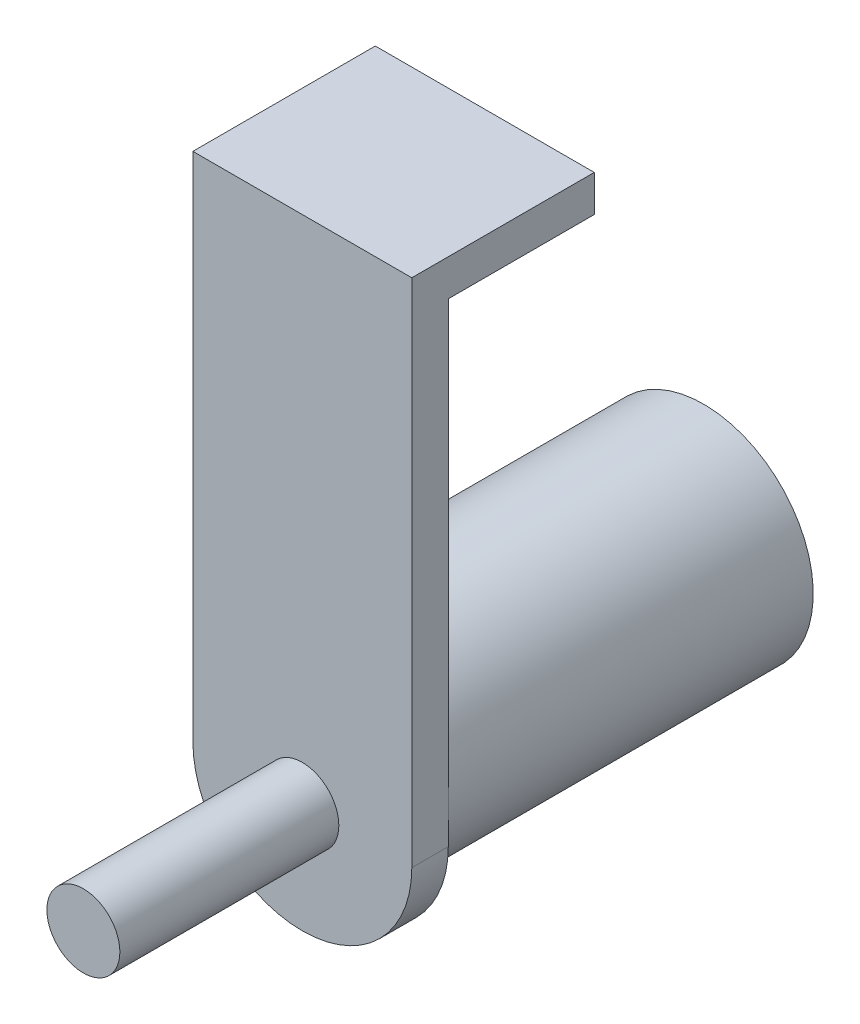
ISO-10303-21;
HEADER;
FILE_DESCRIPTION(('STEP AP214'),'2;1');
FILE_NAME('part.step','',(''),(''),'','','');
FILE_SCHEMA(('AUTOMOTIVE_DESIGN { 1 0 10303 214 1 1 1 1 }'));
ENDSEC;
DATA;
#1=APPLICATION_CONTEXT('core data for automotive mechanical design processes');
#2=APPLICATION_PROTOCOL_DEFINITION('international standard','automotive_design',2000,#1);
#3=PRODUCT_CONTEXT('',#1,'mechanical');
#4=PRODUCT('Part','Part','',(#3));
#5=PRODUCT_RELATED_PRODUCT_CATEGORY('part','',(#4));
#6=PRODUCT_DEFINITION_FORMATION('','',#4);
#7=PRODUCT_DEFINITION_CONTEXT('part definition',#1,'design');
#8=PRODUCT_DEFINITION('design','',#6,#7);
#9=PRODUCT_DEFINITION_SHAPE('','',#8);
#10=(LENGTH_UNIT() NAMED_UNIT(*) SI_UNIT(.MILLI.,.METRE.));
#11=(NAMED_UNIT(*) PLANE_ANGLE_UNIT() SI_UNIT($,.RADIAN.));
#12=(NAMED_UNIT(*) SI_UNIT($,.STERADIAN.) SOLID_ANGLE_UNIT());
#13=UNCERTAINTY_MEASURE_WITH_UNIT(LENGTH_MEASURE(1.E-05),#10,'distance_accuracy_value','');
#14=(GEOMETRIC_REPRESENTATION_CONTEXT(3) GLOBAL_UNCERTAINTY_ASSIGNED_CONTEXT((#13)) GLOBAL_UNIT_ASSIGNED_CONTEXT((#10,
#11,#12)) REPRESENTATION_CONTEXT('',''));
#15=CARTESIAN_POINT('',(0.,0.,0.));
#16=DIRECTION('',(0.,0.,1.));
#17=DIRECTION('',(1.,0.,0.));
#18=AXIS2_PLACEMENT_3D('',#15,#16,#17);
#19=CARTESIAN_POINT('',(0.,-34.999999886007,0.));
#20=DIRECTION('',(0.,0.,1.));
#21=DIRECTION('',(1.,0.,0.));
#22=AXIS2_PLACEMENT_3D('',#19,#20,#21);
#23=PLANE('',#22);
#24=CARTESIAN_POINT('',(0.,-30.,0.));
#25=DIRECTION('',(0.,0.,-1.));
#26=DIRECTION('',(-1.,0.,0.));
#27=AXIS2_PLACEMENT_3D('',#24,#25,#26);
#28=CIRCLE('',#27,15.);
#29=CARTESIAN_POINT('',(15.,-30.,0.));
#30=VERTEX_POINT('',#29);
#31=CARTESIAN_POINT('',(-15.,-30.,0.));
#32=VERTEX_POINT('',#31);
#33=EDGE_CURVE('E172',#30,#32,#28,.T.);
#34=ORIENTED_EDGE('',*,*,#33,.F.);
#35=DIRECTION('',(0.,1.,0.));
#36=VECTOR('',#35,1.);
#37=CARTESIAN_POINT('',(15.,35.,0.));
#38=LINE('',#37,#36);
#39=CARTESIAN_POINT('',(15.,-34.9999997720139,0.));
#40=VERTEX_POINT('',#39);
#41=EDGE_CURVE('E217',#40,#30,#38,.T.);
#42=ORIENTED_EDGE('',*,*,#41,.F.);
#43=CARTESIAN_POINT('',(0.,-34.999999886007,0.));
#44=DIRECTION('',(0.,0.,1.));
#45=DIRECTION('',(1.,0.,0.));
#46=AXIS2_PLACEMENT_3D('',#43,#44,#45);
#47=CIRCLE('',#46,15.);
#48=CARTESIAN_POINT('',(-15.,-35.,0.));
#49=VERTEX_POINT('',#48);
#50=EDGE_CURVE('E231',#49,#40,#47,.T.);
#51=ORIENTED_EDGE('',*,*,#50,.F.);
#52=DIRECTION('',(0.,-1.,0.));
#53=VECTOR('',#52,1.);
#54=CARTESIAN_POINT('',(-15.,35.,0.));
#55=LINE('',#54,#53);
#56=EDGE_CURVE('E211',#32,#49,#55,.T.);
#57=ORIENTED_EDGE('',*,*,#56,.F.);
#58=EDGE_LOOP('',(#34,#42,#51,#57));
#59=FACE_BOUND('',#58,.T.);
#60=ADVANCED_FACE('F42',(#59),#23,.F.);
#61=EDGE_CURVE('E67',#32,#30,#28,.T.);
#62=ORIENTED_EDGE('',*,*,#61,.F.);
#63=CARTESIAN_POINT('',(-15.,30.,0.));
#64=VERTEX_POINT('',#63);
#65=EDGE_CURVE('E227',#64,#32,#55,.T.);
#66=ORIENTED_EDGE('',*,*,#65,.F.);
#67=DIRECTION('',(-1.,0.,0.));
#68=VECTOR('',#67,1.);
#69=CARTESIAN_POINT('',(15.,30.,0.));
#70=LINE('',#69,#68);
#71=CARTESIAN_POINT('',(15.,30.,0.));
#72=VERTEX_POINT('',#71);
#73=EDGE_CURVE('E180',#72,#64,#70,.T.);
#74=ORIENTED_EDGE('',*,*,#73,.F.);
#75=EDGE_CURVE('E234',#30,#72,#38,.T.);
#76=ORIENTED_EDGE('',*,*,#75,.F.);
#77=EDGE_LOOP('',(#62,#66,#74,#76));
#78=FACE_BOUND('',#77,.T.);
#79=ADVANCED_FACE('F276',(#78),#23,.F.);
#80=CARTESIAN_POINT('',(0.,-34.999999886007,5.));
#81=DIRECTION('',(0.,0.,1.));
#82=DIRECTION('',(1.,0.,0.));
#83=AXIS2_PLACEMENT_3D('',#80,#81,#82);
#84=PLANE('',#83);
#85=CARTESIAN_POINT('',(0.,-34.999999886007,5.));
#86=DIRECTION('',(0.,0.,1.));
#87=DIRECTION('',(1.,0.,0.));
#88=AXIS2_PLACEMENT_3D('',#85,#86,#87);
#89=CIRCLE('',#88,5.);
#90=CARTESIAN_POINT('',(5.00000000000001,-34.999999886007,5.));
#91=VERTEX_POINT('',#90);
#92=EDGE_CURVE('E169',#91,#91,#89,.T.);
#93=ORIENTED_EDGE('',*,*,#92,.F.);
#94=EDGE_LOOP('',(#93));
#95=FACE_BOUND('',#94,.T.);
#96=DIRECTION('',(0.,-1.,0.));
#97=VECTOR('',#96,1.);
#98=CARTESIAN_POINT('',(-15.,35.,5.));
#99=LINE('',#98,#97);
#100=CARTESIAN_POINT('',(-15.,35.,5.));
#101=VERTEX_POINT('',#100);
#102=CARTESIAN_POINT('',(-15.,-35.,5.));
#103=VERTEX_POINT('',#102);
#104=EDGE_CURVE('E212',#101,#103,#99,.T.);
#105=ORIENTED_EDGE('',*,*,#104,.T.);
#106=CARTESIAN_POINT('',(0.,-34.999999886007,5.));
#107=DIRECTION('',(0.,0.,1.));
#108=DIRECTION('',(1.,0.,0.));
#109=AXIS2_PLACEMENT_3D('',#106,#107,#108);
#110=CIRCLE('',#109,15.);
#111=CARTESIAN_POINT('',(15.,-34.9999997720139,5.));
#112=VERTEX_POINT('',#111);
#113=EDGE_CURVE('E216',#103,#112,#110,.T.);
#114=ORIENTED_EDGE('',*,*,#113,.T.);
#115=DIRECTION('',(0.,1.,0.));
#116=VECTOR('',#115,1.);
#117=CARTESIAN_POINT('',(15.,35.,5.));
#118=LINE('',#117,#116);
#119=CARTESIAN_POINT('',(15.,35.,5.));
#120=VERTEX_POINT('',#119);
#121=EDGE_CURVE('E220',#112,#120,#118,.T.);
#122=ORIENTED_EDGE('',*,*,#121,.T.);
#123=DIRECTION('',(-1.,0.,0.));
#124=VECTOR('',#123,1.);
#125=CARTESIAN_POINT('',(-15.,35.,5.));
#126=LINE('',#125,#124);
#127=EDGE_CURVE('E223',#120,#101,#126,.T.);
#128=ORIENTED_EDGE('',*,*,#127,.T.);
#129=EDGE_LOOP('',(#105,#114,#122,#128));
#130=FACE_BOUND('',#129,.T.);
#131=ADVANCED_FACE('F281',(#95,#130),#84,.T.);
#132=CARTESIAN_POINT('',(-15.,35.,5.));
#133=DIRECTION('',(1.,0.,0.));
#134=DIRECTION('',(0.,1.,0.));
#135=AXIS2_PLACEMENT_3D('',#132,#133,#134);
#136=PLANE('',#135);
#137=DIRECTION('',(0.,0.,-1.));
#138=VECTOR('',#137,1.);
#139=CARTESIAN_POINT('',(-15.,35.,5.));
#140=LINE('',#139,#138);
#141=CARTESIAN_POINT('',(-15.,35.,-20.));
#142=VERTEX_POINT('',#141);
#143=EDGE_CURVE('E226',#101,#142,#140,.T.);
#144=ORIENTED_EDGE('',*,*,#143,.T.);
#145=DIRECTION('',(0.,1.,0.));
#146=VECTOR('',#145,1.);
#147=CARTESIAN_POINT('',(-15.,35.,-20.));
#148=LINE('',#147,#146);
#149=CARTESIAN_POINT('',(-15.,30.,-20.));
#150=VERTEX_POINT('',#149);
#151=EDGE_CURVE('E188',#150,#142,#148,.T.);
#152=ORIENTED_EDGE('',*,*,#151,.F.);
#153=DIRECTION('',(0.,0.,1.));
#154=VECTOR('',#153,1.);
#155=CARTESIAN_POINT('',(-15.,30.,-20.));
#156=LINE('',#155,#154);
#157=EDGE_CURVE('E196',#150,#64,#156,.T.);
#158=ORIENTED_EDGE('',*,*,#157,.T.);
#159=ORIENTED_EDGE('',*,*,#65,.T.);
#160=ORIENTED_EDGE('',*,*,#56,.T.);
#161=DIRECTION('',(0.,0.,-1.));
#162=VECTOR('',#161,1.);
#163=CARTESIAN_POINT('',(-15.,-35.,5.));
#164=LINE('',#163,#162);
#165=EDGE_CURVE('E11',#103,#49,#164,.T.);
#166=ORIENTED_EDGE('',*,*,#165,.F.);
#167=ORIENTED_EDGE('',*,*,#104,.F.);
#168=EDGE_LOOP('',(#144,#152,#158,#159,#160,#166,#167));
#169=FACE_BOUND('',#168,.T.);
#170=ADVANCED_FACE('F44',(#169),#136,.F.);
#171=CARTESIAN_POINT('',(0.,-34.999999886007,5.));
#172=DIRECTION('',(0.,0.,-1.));
#173=DIRECTION('',(-1.,0.,0.));
#174=AXIS2_PLACEMENT_3D('',#171,#172,#173);
#175=CYLINDRICAL_SURFACE('',#174,15.);
#176=ORIENTED_EDGE('',*,*,#50,.T.);
#177=DIRECTION('',(0.,0.,-1.));
#178=VECTOR('',#177,1.);
#179=CARTESIAN_POINT('',(15.,-34.9999997720139,5.));
#180=LINE('',#179,#178);
#181=EDGE_CURVE('E52',#112,#40,#180,.T.);
#182=ORIENTED_EDGE('',*,*,#181,.F.);
#183=ORIENTED_EDGE('',*,*,#113,.F.);
#184=ORIENTED_EDGE('',*,*,#165,.T.);
#185=EDGE_LOOP('',(#176,#182,#183,#184));
#186=FACE_BOUND('',#185,.T.);
#187=ADVANCED_FACE('F291',(#186),#175,.T.);
#188=CARTESIAN_POINT('',(15.,35.,5.));
#189=DIRECTION('',(-1.,0.,0.));
#190=DIRECTION('',(0.,-1.,0.));
#191=AXIS2_PLACEMENT_3D('',#188,#189,#190);
#192=PLANE('',#191);
#193=ORIENTED_EDGE('',*,*,#41,.T.);
#194=ORIENTED_EDGE('',*,*,#75,.T.);
#195=DIRECTION('',(0.,0.,1.));
#196=VECTOR('',#195,1.);
#197=CARTESIAN_POINT('',(15.,30.,-20.));
#198=LINE('',#197,#196);
#199=CARTESIAN_POINT('',(15.,30.,-20.));
#200=VERTEX_POINT('',#199);
#201=EDGE_CURVE('E203',#200,#72,#198,.T.);
#202=ORIENTED_EDGE('',*,*,#201,.F.);
#203=DIRECTION('',(0.,-1.,0.));
#204=VECTOR('',#203,1.);
#205=CARTESIAN_POINT('',(15.,35.,-20.));
#206=LINE('',#205,#204);
#207=CARTESIAN_POINT('',(15.,35.,-20.));
#208=VERTEX_POINT('',#207);
#209=EDGE_CURVE('E181',#208,#200,#206,.T.);
#210=ORIENTED_EDGE('',*,*,#209,.F.);
#211=DIRECTION('',(0.,0.,-1.));
#212=VECTOR('',#211,1.);
#213=CARTESIAN_POINT('',(15.,35.,5.));
#214=LINE('',#213,#212);
#215=EDGE_CURVE('E239',#120,#208,#214,.T.);
#216=ORIENTED_EDGE('',*,*,#215,.F.);
#217=ORIENTED_EDGE('',*,*,#121,.F.);
#218=ORIENTED_EDGE('',*,*,#181,.T.);
#219=EDGE_LOOP('',(#193,#194,#202,#210,#216,#217,#218));
#220=FACE_BOUND('',#219,.T.);
#221=ADVANCED_FACE('F247',(#220),#192,.F.);
#222=CARTESIAN_POINT('',(-15.,35.,5.));
#223=DIRECTION('',(0.,-1.,0.));
#224=DIRECTION('',(0.,0.,-1.));
#225=AXIS2_PLACEMENT_3D('',#222,#223,#224);
#226=PLANE('',#225);
#227=ORIENTED_EDGE('',*,*,#215,.T.);
#228=DIRECTION('',(1.,0.,0.));
#229=VECTOR('',#228,1.);
#230=CARTESIAN_POINT('',(15.,35.,-20.));
#231=LINE('',#230,#229);
#232=EDGE_CURVE('E192',#142,#208,#231,.T.);
#233=ORIENTED_EDGE('',*,*,#232,.F.);
#234=ORIENTED_EDGE('',*,*,#143,.F.);
#235=ORIENTED_EDGE('',*,*,#127,.F.);
#236=EDGE_LOOP('',(#227,#233,#234,#235));
#237=FACE_BOUND('',#236,.T.);
#238=ADVANCED_FACE('F285',(#237),#226,.F.);
#239=CARTESIAN_POINT('',(15.,30.,-20.));
#240=DIRECTION('',(0.,1.,0.));
#241=DIRECTION('',(0.,0.,1.));
#242=AXIS2_PLACEMENT_3D('',#239,#240,#241);
#243=PLANE('',#242);
#244=ORIENTED_EDGE('',*,*,#73,.T.);
#245=ORIENTED_EDGE('',*,*,#157,.F.);
#246=DIRECTION('',(-1.,0.,0.));
#247=VECTOR('',#246,1.);
#248=CARTESIAN_POINT('',(15.,30.,-20.));
#249=LINE('',#248,#247);
#250=EDGE_CURVE('E185',#200,#150,#249,.T.);
#251=ORIENTED_EDGE('',*,*,#250,.F.);
#252=ORIENTED_EDGE('',*,*,#201,.T.);
#253=EDGE_LOOP('',(#244,#245,#251,#252));
#254=FACE_BOUND('',#253,.T.);
#255=ADVANCED_FACE('F288',(#254),#243,.F.);
#256=CARTESIAN_POINT('',(0.,0.,-20.));
#257=DIRECTION('',(0.,0.,-1.));
#258=DIRECTION('',(-1.,0.,0.));
#259=AXIS2_PLACEMENT_3D('',#256,#257,#258);
#260=PLANE('',#259);
#261=ORIENTED_EDGE('',*,*,#209,.T.);
#262=ORIENTED_EDGE('',*,*,#250,.T.);
#263=ORIENTED_EDGE('',*,*,#151,.T.);
#264=ORIENTED_EDGE('',*,*,#232,.T.);
#265=EDGE_LOOP('',(#261,#262,#263,#264));
#266=FACE_BOUND('',#265,.T.);
#267=ADVANCED_FACE('F269',(#266),#260,.T.);
#268=CARTESIAN_POINT('',(0.,-34.999999886007,20.));
#269=DIRECTION('',(0.,0.,-1.));
#270=DIRECTION('',(-1.,0.,0.));
#271=AXIS2_PLACEMENT_3D('',#268,#269,#270);
#272=CYLINDRICAL_SURFACE('',#271,5.);
#273=ORIENTED_EDGE('',*,*,#92,.T.);
#274=EDGE_LOOP('',(#273));
#275=FACE_BOUND('',#274,.T.);
#276=CARTESIAN_POINT('',(0.,-34.999999886007,35.));
#277=DIRECTION('',(0.,0.,1.));
#278=DIRECTION('',(1.,0.,0.));
#279=AXIS2_PLACEMENT_3D('',#276,#277,#278);
#280=CIRCLE('',#279,5.);
#281=CARTESIAN_POINT('',(5.00000000000001,-34.999999886007,35.));
#282=VERTEX_POINT('',#281);
#283=EDGE_CURVE('E147',#282,#282,#280,.T.);
#284=ORIENTED_EDGE('',*,*,#283,.F.);
#285=EDGE_LOOP('',(#284));
#286=FACE_BOUND('',#285,.T.);
#287=ADVANCED_FACE('F259',(#275,#286),#272,.T.);
#288=CARTESIAN_POINT('',(0.,-30.,-50.));
#289=DIRECTION('',(0.,0.,1.));
#290=DIRECTION('',(1.,0.,0.));
#291=AXIS2_PLACEMENT_3D('',#288,#289,#290);
#292=CYLINDRICAL_SURFACE('',#291,15.);
#293=CARTESIAN_POINT('',(0.,-30.,-50.));
#294=DIRECTION('',(0.,0.,-1.));
#295=DIRECTION('',(-1.,0.,0.));
#296=AXIS2_PLACEMENT_3D('',#293,#294,#295);
#297=CIRCLE('',#296,15.);
#298=CARTESIAN_POINT('',(-15.,-30.,-50.));
#299=VERTEX_POINT('',#298);
#300=EDGE_CURVE('E165',#299,#299,#297,.T.);
#301=ORIENTED_EDGE('',*,*,#300,.F.);
#302=EDGE_LOOP('',(#301));
#303=FACE_BOUND('',#302,.T.);
#304=ORIENTED_EDGE('',*,*,#61,.T.);
#305=ORIENTED_EDGE('',*,*,#33,.T.);
#306=EDGE_LOOP('',(#304,#305));
#307=FACE_BOUND('',#306,.T.);
#308=ADVANCED_FACE('F256',(#303,#307),#292,.T.);
#309=CARTESIAN_POINT('',(0.,-30.,-50.));
#310=DIRECTION('',(0.,0.,-1.));
#311=DIRECTION('',(-1.,0.,0.));
#312=AXIS2_PLACEMENT_3D('',#309,#310,#311);
#313=PLANE('',#312);
#314=ORIENTED_EDGE('',*,*,#300,.T.);
#315=EDGE_LOOP('',(#314));
#316=FACE_BOUND('',#315,.T.);
#317=ADVANCED_FACE('F258',(#316),#313,.T.);
#318=CARTESIAN_POINT('',(0.,0.,35.));
#319=DIRECTION('',(0.,0.,1.));
#320=DIRECTION('',(1.,0.,0.));
#321=AXIS2_PLACEMENT_3D('',#318,#319,#320);
#322=PLANE('',#321);
#323=ORIENTED_EDGE('',*,*,#283,.T.);
#324=EDGE_LOOP('',(#323));
#325=FACE_BOUND('',#324,.T.);
#326=ADVANCED_FACE('F266',(#325),#322,.T.);
#327=CLOSED_SHELL('',(#60,#79,#131,#170,#187,#221,#238,#255,#267,#287,#308,#317,#326));
#328=CARTESIAN_POINT('',(0.,-30.,0.));
#329=DIRECTION('',(0.,0.,-1.));
#330=DIRECTION('',(-1.,0.,0.));
#331=AXIS2_PLACEMENT_3D('',#328,#329,#330);
#332=PLANE('',#331);
#333=CARTESIAN_POINT('',(0.,-34.999999886007,0.));
#334=DIRECTION('',(0.,0.,1.));
#335=DIRECTION('',(1.,0.,0.));
#336=AXIS2_PLACEMENT_3D('',#333,#334,#335);
#337=CIRCLE('',#336,0.760202629859198);
#338=CARTESIAN_POINT('',(0.760202629859202,-34.999999886007,0.));
#339=VERTEX_POINT('',#338);
#340=EDGE_CURVE('E207',#339,#339,#337,.T.);
#341=ORIENTED_EDGE('',*,*,#340,.T.);
#342=EDGE_LOOP('',(#341));
#343=FACE_BOUND('',#342,.T.);
#344=ADVANCED_FACE('F343',(#343),#332,.F.);
#345=CARTESIAN_POINT('',(0.,-34.999999886007,5.));
#346=DIRECTION('',(0.,0.,-1.));
#347=DIRECTION('',(-1.,0.,0.));
#348=AXIS2_PLACEMENT_3D('',#345,#346,#347);
#349=CYLINDRICAL_SURFACE('',#348,0.760202629859198);
#350=CARTESIAN_POINT('',(0.,-34.999999886007,5.));
#351=DIRECTION('',(0.,0.,1.));
#352=DIRECTION('',(1.,0.,0.));
#353=AXIS2_PLACEMENT_3D('',#350,#351,#352);
#354=CIRCLE('',#353,0.760202629859198);
#355=CARTESIAN_POINT('',(0.760202629859202,-34.999999886007,5.));
#356=VERTEX_POINT('',#355);
#357=EDGE_CURVE('E176',#356,#356,#354,.T.);
#358=ORIENTED_EDGE('',*,*,#357,.T.);
#359=EDGE_LOOP('',(#358));
#360=FACE_BOUND('',#359,.T.);
#361=ORIENTED_EDGE('',*,*,#340,.F.);
#362=EDGE_LOOP('',(#361));
#363=FACE_BOUND('',#362,.T.);
#364=ADVANCED_FACE('F344',(#360,#363),#349,.F.);
#365=CARTESIAN_POINT('',(0.,-34.999999886007,5.));
#366=DIRECTION('',(0.,0.,1.));
#367=DIRECTION('',(1.,0.,0.));
#368=AXIS2_PLACEMENT_3D('',#365,#366,#367);
#369=PLANE('',#368);
#370=DIRECTION('',(-1.,0.,0.));
#371=VECTOR('',#370,1.);
#372=CARTESIAN_POINT('',(-0.0499999999999957,-34.949999886007,5.));
#373=LINE('',#372,#371);
#374=CARTESIAN_POINT('',(0.0500000000000043,-34.949999886007,5.));
#375=VERTEX_POINT('',#374);
#376=CARTESIAN_POINT('',(-0.0499999999999957,-34.949999886007,5.));
#377=VERTEX_POINT('',#376);
#378=EDGE_CURVE('E155',#375,#377,#373,.T.);
#379=ORIENTED_EDGE('',*,*,#378,.T.);
#380=DIRECTION('',(0.,-1.,0.));
#381=VECTOR('',#380,1.);
#382=CARTESIAN_POINT('',(-0.0499999999999957,-35.049999886007,5.));
#383=LINE('',#382,#381);
#384=CARTESIAN_POINT('',(-0.0499999999999957,-35.049999886007,5.));
#385=VERTEX_POINT('',#384);
#386=EDGE_CURVE('E310',#377,#385,#383,.T.);
#387=ORIENTED_EDGE('',*,*,#386,.T.);
#388=DIRECTION('',(1.,0.,0.));
#389=VECTOR('',#388,1.);
#390=CARTESIAN_POINT('',(-0.0499999999999957,-35.049999886007,5.));
#391=LINE('',#390,#389);
#392=CARTESIAN_POINT('',(0.0500000000000043,-35.049999886007,5.));
#393=VERTEX_POINT('',#392);
#394=EDGE_CURVE('E151',#385,#393,#391,.T.);
#395=ORIENTED_EDGE('',*,*,#394,.T.);
#396=DIRECTION('',(0.,1.,0.));
#397=VECTOR('',#396,1.);
#398=CARTESIAN_POINT('',(0.0500000000000043,-35.049999886007,5.));
#399=LINE('',#398,#397);
#400=EDGE_CURVE('E59',#393,#375,#399,.T.);
#401=ORIENTED_EDGE('',*,*,#400,.T.);
#402=EDGE_LOOP('',(#379,#387,#395,#401));
#403=FACE_BOUND('',#402,.T.);
#404=ORIENTED_EDGE('',*,*,#357,.F.);
#405=EDGE_LOOP('',(#404));
#406=FACE_BOUND('',#405,.T.);
#407=ADVANCED_FACE('F341',(#403,#406),#369,.F.);
#408=CARTESIAN_POINT('',(-0.0499999999999957,-35.049999886007,5.));
#409=DIRECTION('',(0.,-1.,0.));
#410=DIRECTION('',(0.,0.,-1.));
#411=AXIS2_PLACEMENT_3D('',#408,#409,#410);
#412=PLANE('',#411);
#413=DIRECTION('',(1.,0.,0.));
#414=VECTOR('',#413,1.);
#415=CARTESIAN_POINT('',(-0.0499999999999957,-35.049999886007,20.));
#416=LINE('',#415,#414);
#417=CARTESIAN_POINT('',(-0.0499999999999957,-35.049999886007,20.));
#418=VERTEX_POINT('',#417);
#419=CARTESIAN_POINT('',(0.0500000000000043,-35.049999886007,20.));
#420=VERTEX_POINT('',#419);
#421=EDGE_CURVE('E128',#418,#420,#416,.T.);
#422=ORIENTED_EDGE('',*,*,#421,.T.);
#423=DIRECTION('',(0.,0.,1.));
#424=VECTOR('',#423,1.);
#425=CARTESIAN_POINT('',(0.0500000000000043,-35.049999886007,5.));
#426=LINE('',#425,#424);
#427=EDGE_CURVE('E154',#393,#420,#426,.T.);
#428=ORIENTED_EDGE('',*,*,#427,.F.);
#429=ORIENTED_EDGE('',*,*,#394,.F.);
#430=DIRECTION('',(0.,0.,1.));
#431=VECTOR('',#430,1.);
#432=CARTESIAN_POINT('',(-0.0499999999999957,-35.049999886007,5.));
#433=LINE('',#432,#431);
#434=EDGE_CURVE('E142',#385,#418,#433,.T.);
#435=ORIENTED_EDGE('',*,*,#434,.T.);
#436=EDGE_LOOP('',(#422,#428,#429,#435));
#437=FACE_BOUND('',#436,.T.);
#438=ADVANCED_FACE('F149',(#437),#412,.F.);
#439=CARTESIAN_POINT('',(0.0500000000000043,-35.049999886007,5.));
#440=DIRECTION('',(1.,0.,0.));
#441=DIRECTION('',(0.,0.,-1.));
#442=AXIS2_PLACEMENT_3D('',#439,#440,#441);
#443=PLANE('',#442);
#444=DIRECTION('',(0.,1.,0.));
#445=VECTOR('',#444,1.);
#446=CARTESIAN_POINT('',(0.0500000000000043,-35.049999886007,20.));
#447=LINE('',#446,#445);
#448=CARTESIAN_POINT('',(0.0500000000000043,-34.949999886007,20.));
#449=VERTEX_POINT('',#448);
#450=EDGE_CURVE('E134',#420,#449,#447,.T.);
#451=ORIENTED_EDGE('',*,*,#450,.T.);
#452=DIRECTION('',(0.,0.,1.));
#453=VECTOR('',#452,1.);
#454=CARTESIAN_POINT('',(0.0500000000000043,-34.949999886007,5.));
#455=LINE('',#454,#453);
#456=EDGE_CURVE('E159',#375,#449,#455,.T.);
#457=ORIENTED_EDGE('',*,*,#456,.F.);
#458=ORIENTED_EDGE('',*,*,#400,.F.);
#459=ORIENTED_EDGE('',*,*,#427,.T.);
#460=EDGE_LOOP('',(#451,#457,#458,#459));
#461=FACE_BOUND('',#460,.T.);
#462=ADVANCED_FACE('F336',(#461),#443,.F.);
#463=CARTESIAN_POINT('',(-0.0499999999999957,-34.949999886007,5.));
#464=DIRECTION('',(0.,1.,0.));
#465=DIRECTION('',(0.,0.,1.));
#466=AXIS2_PLACEMENT_3D('',#463,#464,#465);
#467=PLANE('',#466);
#468=DIRECTION('',(-1.,0.,0.));
#469=VECTOR('',#468,1.);
#470=CARTESIAN_POINT('',(-0.0499999999999957,-34.949999886007,20.));
#471=LINE('',#470,#469);
#472=CARTESIAN_POINT('',(-0.0499999999999957,-34.949999886007,20.));
#473=VERTEX_POINT('',#472);
#474=EDGE_CURVE('E307',#449,#473,#471,.T.);
#475=ORIENTED_EDGE('',*,*,#474,.T.);
#476=DIRECTION('',(0.,0.,1.));
#477=VECTOR('',#476,1.);
#478=CARTESIAN_POINT('',(-0.0499999999999957,-34.949999886007,5.));
#479=LINE('',#478,#477);
#480=EDGE_CURVE('E144',#377,#473,#479,.T.);
#481=ORIENTED_EDGE('',*,*,#480,.F.);
#482=ORIENTED_EDGE('',*,*,#378,.F.);
#483=ORIENTED_EDGE('',*,*,#456,.T.);
#484=EDGE_LOOP('',(#475,#481,#482,#483));
#485=FACE_BOUND('',#484,.T.);
#486=ADVANCED_FACE('F333',(#485),#467,.F.);
#487=CARTESIAN_POINT('',(-0.0499999999999957,-35.049999886007,5.));
#488=DIRECTION('',(-1.,0.,0.));
#489=DIRECTION('',(0.,0.,1.));
#490=AXIS2_PLACEMENT_3D('',#487,#488,#489);
#491=PLANE('',#490);
#492=DIRECTION('',(0.,-1.,0.));
#493=VECTOR('',#492,1.);
#494=CARTESIAN_POINT('',(-0.0499999999999957,-35.049999886007,20.));
#495=LINE('',#494,#493);
#496=EDGE_CURVE('E131',#473,#418,#495,.T.);
#497=ORIENTED_EDGE('',*,*,#496,.T.);
#498=ORIENTED_EDGE('',*,*,#434,.F.);
#499=ORIENTED_EDGE('',*,*,#386,.F.);
#500=ORIENTED_EDGE('',*,*,#480,.T.);
#501=EDGE_LOOP('',(#497,#498,#499,#500));
#502=FACE_BOUND('',#501,.T.);
#503=ADVANCED_FACE('F140',(#502),#491,.F.);
#504=CARTESIAN_POINT('',(0.,0.,20.));
#505=DIRECTION('',(0.,0.,1.));
#506=DIRECTION('',(1.,0.,0.));
#507=AXIS2_PLACEMENT_3D('',#504,#505,#506);
#508=PLANE('',#507);
#509=ORIENTED_EDGE('',*,*,#496,.F.);
#510=ORIENTED_EDGE('',*,*,#474,.F.);
#511=ORIENTED_EDGE('',*,*,#450,.F.);
#512=ORIENTED_EDGE('',*,*,#421,.F.);
#513=EDGE_LOOP('',(#509,#510,#511,#512));
#514=FACE_BOUND('',#513,.T.);
#515=ADVANCED_FACE('F130',(#514),#508,.F.);
#516=CLOSED_SHELL('',(#344,#364,#407,#438,#462,#486,#503,#515));
#517=ORIENTED_CLOSED_SHELL('',*,#516,.T.);
#518=BREP_WITH_VOIDS('B2',#327,(#517));
#519=ADVANCED_BREP_SHAPE_REPRESENTATION('',(#18,#518),#14);
#520=SHAPE_DEFINITION_REPRESENTATION(#9,#519);
ENDSEC;
END-ISO-10303-21;
